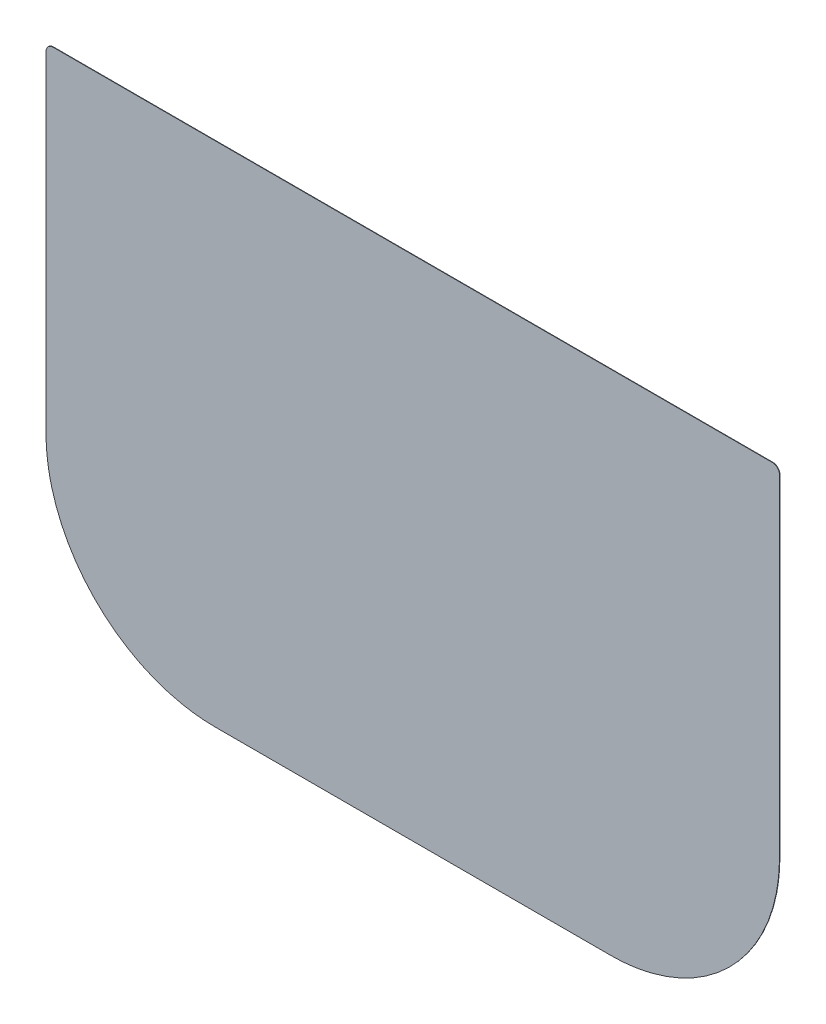
ISO-10303-21;
HEADER;
FILE_DESCRIPTION(('STEP AP214'),'2;1');
FILE_NAME('part.step','',(''),(''),'','','');
FILE_SCHEMA(('AUTOMOTIVE_DESIGN { 1 0 10303 214 1 1 1 1 }'));
ENDSEC;
DATA;
#1=APPLICATION_CONTEXT('core data for automotive mechanical design processes');
#2=APPLICATION_PROTOCOL_DEFINITION('international standard','automotive_design',2000,#1);
#3=PRODUCT_CONTEXT('',#1,'mechanical');
#4=PRODUCT('Part','Part','',(#3));
#5=PRODUCT_RELATED_PRODUCT_CATEGORY('part','',(#4));
#6=PRODUCT_DEFINITION_FORMATION('','',#4);
#7=PRODUCT_DEFINITION_CONTEXT('part definition',#1,'design');
#8=PRODUCT_DEFINITION('design','',#6,#7);
#9=PRODUCT_DEFINITION_SHAPE('','',#8);
#10=(LENGTH_UNIT() NAMED_UNIT(*) SI_UNIT(.MILLI.,.METRE.));
#11=(NAMED_UNIT(*) PLANE_ANGLE_UNIT() SI_UNIT($,.RADIAN.));
#12=(NAMED_UNIT(*) SI_UNIT($,.STERADIAN.) SOLID_ANGLE_UNIT());
#13=UNCERTAINTY_MEASURE_WITH_UNIT(LENGTH_MEASURE(1.E-05),#10,'distance_accuracy_value','');
#14=(GEOMETRIC_REPRESENTATION_CONTEXT(3) GLOBAL_UNCERTAINTY_ASSIGNED_CONTEXT((#13)) GLOBAL_UNIT_ASSIGNED_CONTEXT((#10,
#11,#12)) REPRESENTATION_CONTEXT('',''));
#15=CARTESIAN_POINT('',(0.,0.,0.));
#16=DIRECTION('',(0.,0.,1.));
#17=DIRECTION('',(1.,0.,0.));
#18=AXIS2_PLACEMENT_3D('',#15,#16,#17);
#19=CARTESIAN_POINT('',(133.695098624677,104.963199661161,0.2));
#20=DIRECTION('',(0.,0.,-1.));
#21=DIRECTION('',(-1.,0.,0.));
#22=AXIS2_PLACEMENT_3D('',#19,#20,#21);
#23=CYLINDRICAL_SURFACE('',#22,75.7951241974776);
#24=CARTESIAN_POINT('',(133.695098624677,104.963199661161,0.));
#25=DIRECTION('',(0.,0.,1.));
#26=DIRECTION('',(1.,0.,0.));
#27=AXIS2_PLACEMENT_3D('',#24,#25,#26);
#28=CIRCLE('',#27,75.7951241974776);
#29=CARTESIAN_POINT('',(94.6448692825477,40.0018231329636,0.));
#30=VERTEX_POINT('',#29);
#31=CARTESIAN_POINT('',(118.987614900912,30.6087056838208,0.));
#32=VERTEX_POINT('',#31);
#33=EDGE_CURVE('E189',#30,#32,#28,.T.);
#34=ORIENTED_EDGE('',*,*,#33,.T.);
#35=DIRECTION('',(0.,0.,-1.));
#36=VECTOR('',#35,1.);
#37=CARTESIAN_POINT('',(118.987614900912,30.6087056838208,0.2));
#38=LINE('',#37,#36);
#39=CARTESIAN_POINT('',(118.987614900912,30.6087056838208,0.2));
#40=VERTEX_POINT('',#39);
#41=EDGE_CURVE('E11',#40,#32,#38,.T.);
#42=ORIENTED_EDGE('',*,*,#41,.F.);
#43=CARTESIAN_POINT('',(133.695098624677,104.963199661161,0.2));
#44=DIRECTION('',(0.,0.,1.));
#45=DIRECTION('',(1.,0.,0.));
#46=AXIS2_PLACEMENT_3D('',#43,#44,#45);
#47=CIRCLE('',#46,75.7951241974776);
#48=CARTESIAN_POINT('',(94.6448692825477,40.0018231329636,0.2));
#49=VERTEX_POINT('',#48);
#50=EDGE_CURVE('E223',#49,#40,#47,.T.);
#51=ORIENTED_EDGE('',*,*,#50,.F.);
#52=DIRECTION('',(0.,0.,-1.));
#53=VECTOR('',#52,1.);
#54=CARTESIAN_POINT('',(94.6448692825477,40.0018231329636,0.2));
#55=LINE('',#54,#53);
#56=EDGE_CURVE('E185',#49,#30,#55,.T.);
#57=ORIENTED_EDGE('',*,*,#56,.T.);
#58=EDGE_LOOP('',(#34,#42,#51,#57));
#59=FACE_BOUND('',#58,.T.);
#60=ADVANCED_FACE('F33',(#59),#23,.T.);
#61=CARTESIAN_POINT('',(133.844639792639,105.889225961732,0.2));
#62=DIRECTION('',(0.,0.,-1.));
#63=DIRECTION('',(-1.,0.,0.));
#64=AXIS2_PLACEMENT_3D('',#61,#62,#63);
#65=CYLINDRICAL_SURFACE('',#64,76.7325740604757);
#66=CARTESIAN_POINT('',(133.844639792639,105.889225961732,0.));
#67=DIRECTION('',(0.,0.,1.));
#68=DIRECTION('',(1.,0.,0.));
#69=AXIS2_PLACEMENT_3D('',#66,#67,#68);
#70=CIRCLE('',#69,76.7325740604757);
#71=CARTESIAN_POINT('',(133.877646,29.156659,0.));
#72=VERTEX_POINT('',#71);
#73=EDGE_CURVE('E192',#32,#72,#70,.T.);
#74=ORIENTED_EDGE('',*,*,#73,.T.);
#75=DIRECTION('',(0.,0.,-1.));
#76=VECTOR('',#75,1.);
#77=CARTESIAN_POINT('',(133.877646,29.156659,0.2));
#78=LINE('',#77,#76);
#79=CARTESIAN_POINT('',(133.877646,29.156659,0.2));
#80=VERTEX_POINT('',#79);
#81=EDGE_CURVE('E41',#80,#72,#78,.T.);
#82=ORIENTED_EDGE('',*,*,#81,.F.);
#83=CARTESIAN_POINT('',(133.844639792639,105.889225961732,0.2));
#84=DIRECTION('',(0.,0.,1.));
#85=DIRECTION('',(1.,0.,0.));
#86=AXIS2_PLACEMENT_3D('',#83,#84,#85);
#87=CIRCLE('',#86,76.7325740604757);
#88=EDGE_CURVE('E122',#40,#80,#87,.T.);
#89=ORIENTED_EDGE('',*,*,#88,.F.);
#90=ORIENTED_EDGE('',*,*,#41,.T.);
#91=EDGE_LOOP('',(#74,#82,#89,#90));
#92=FACE_BOUND('',#91,.T.);
#93=ADVANCED_FACE('F331',(#92),#65,.T.);
#94=CARTESIAN_POINT('',(311.4628,29.156659,0.2));
#95=DIRECTION('',(0.,1.,0.));
#96=DIRECTION('',(0.,0.,1.));
#97=AXIS2_PLACEMENT_3D('',#94,#95,#96);
#98=PLANE('',#97);
#99=DIRECTION('',(1.,0.,0.));
#100=VECTOR('',#99,1.);
#101=CARTESIAN_POINT('',(311.4628,29.156659,0.));
#102=LINE('',#101,#100);
#103=CARTESIAN_POINT('',(311.4628,29.156659,0.));
#104=VERTEX_POINT('',#103);
#105=EDGE_CURVE('E194',#72,#104,#102,.T.);
#106=ORIENTED_EDGE('',*,*,#105,.T.);
#107=DIRECTION('',(0.,0.,-1.));
#108=VECTOR('',#107,1.);
#109=CARTESIAN_POINT('',(311.4628,29.156659,0.2));
#110=LINE('',#109,#108);
#111=CARTESIAN_POINT('',(311.4628,29.156659,0.2));
#112=VERTEX_POINT('',#111);
#113=EDGE_CURVE('E260',#112,#104,#110,.T.);
#114=ORIENTED_EDGE('',*,*,#113,.F.);
#115=DIRECTION('',(1.,0.,0.));
#116=VECTOR('',#115,1.);
#117=CARTESIAN_POINT('',(311.4628,29.156659,0.2));
#118=LINE('',#117,#116);
#119=EDGE_CURVE('E268',#80,#112,#118,.T.);
#120=ORIENTED_EDGE('',*,*,#119,.F.);
#121=ORIENTED_EDGE('',*,*,#81,.T.);
#122=EDGE_LOOP('',(#106,#114,#120,#121));
#123=FACE_BOUND('',#122,.T.);
#124=ADVANCED_FACE('F266',(#123),#98,.F.);
#125=CARTESIAN_POINT('',(311.459388599687,106.548561020619,0.2));
#126=DIRECTION('',(0.,0.,-1.));
#127=DIRECTION('',(-1.,0.,0.));
#128=AXIS2_PLACEMENT_3D('',#125,#126,#127);
#129=CYLINDRICAL_SURFACE('',#128,77.3919020958055);
#130=CARTESIAN_POINT('',(311.459388599687,106.548561020619,0.));
#131=DIRECTION('',(0.,0.,1.));
#132=DIRECTION('',(1.,0.,0.));
#133=AXIS2_PLACEMENT_3D('',#130,#131,#132);
#134=CIRCLE('',#133,77.3919020958055);
#135=CARTESIAN_POINT('',(321.271270405472,29.7811624360893,0.));
#136=VERTEX_POINT('',#135);
#137=EDGE_CURVE('E196',#104,#136,#134,.T.);
#138=ORIENTED_EDGE('',*,*,#137,.T.);
#139=DIRECTION('',(0.,0.,-1.));
#140=VECTOR('',#139,1.);
#141=CARTESIAN_POINT('',(321.271270405472,29.7811624360893,0.2));
#142=LINE('',#141,#140);
#143=CARTESIAN_POINT('',(321.271270405472,29.7811624360893,0.2));
#144=VERTEX_POINT('',#143);
#145=EDGE_CURVE('E257',#144,#136,#142,.T.);
#146=ORIENTED_EDGE('',*,*,#145,.F.);
#147=CARTESIAN_POINT('',(311.459388599687,106.548561020619,0.2));
#148=DIRECTION('',(0.,0.,1.));
#149=DIRECTION('',(1.,0.,0.));
#150=AXIS2_PLACEMENT_3D('',#147,#148,#149);
#151=CIRCLE('',#150,77.3919020958055);
#152=EDGE_CURVE('E286',#112,#144,#151,.T.);
#153=ORIENTED_EDGE('',*,*,#152,.F.);
#154=ORIENTED_EDGE('',*,*,#113,.T.);
#155=EDGE_LOOP('',(#138,#146,#153,#154));
#156=FACE_BOUND('',#155,.T.);
#157=ADVANCED_FACE('F277',(#156),#129,.T.);
#158=CARTESIAN_POINT('',(311.583107655466,105.268593305292,0.2));
#159=DIRECTION('',(0.,0.,-1.));
#160=DIRECTION('',(-1.,0.,0.));
#161=AXIS2_PLACEMENT_3D('',#158,#159,#160);
#162=CYLINDRICAL_SURFACE('',#161,76.1065878666445);
#163=CARTESIAN_POINT('',(311.583107655466,105.268593305292,0.));
#164=DIRECTION('',(0.,0.,1.));
#165=DIRECTION('',(1.,0.,0.));
#166=AXIS2_PLACEMENT_3D('',#163,#164,#165);
#167=CIRCLE('',#166,76.1065878666445);
#168=CARTESIAN_POINT('',(330.918478464512,31.6591091855133,0.));
#169=VERTEX_POINT('',#168);
#170=EDGE_CURVE('E198',#136,#169,#167,.T.);
#171=ORIENTED_EDGE('',*,*,#170,.T.);
#172=DIRECTION('',(0.,0.,-1.));
#173=VECTOR('',#172,1.);
#174=CARTESIAN_POINT('',(330.918478464512,31.6591091855133,0.2));
#175=LINE('',#174,#173);
#176=CARTESIAN_POINT('',(330.918478464512,31.6591091855133,0.2));
#177=VERTEX_POINT('',#176);
#178=EDGE_CURVE('E254',#177,#169,#175,.T.);
#179=ORIENTED_EDGE('',*,*,#178,.F.);
#180=CARTESIAN_POINT('',(311.583107655466,105.268593305292,0.2));
#181=DIRECTION('',(0.,0.,1.));
#182=DIRECTION('',(1.,0.,0.));
#183=AXIS2_PLACEMENT_3D('',#180,#181,#182);
#184=CIRCLE('',#183,76.1065878666445);
#185=EDGE_CURVE('E283',#144,#177,#184,.T.);
#186=ORIENTED_EDGE('',*,*,#185,.F.);
#187=ORIENTED_EDGE('',*,*,#145,.T.);
#188=EDGE_LOOP('',(#171,#179,#186,#187));
#189=FACE_BOUND('',#188,.T.);
#190=ADVANCED_FACE('F281',(#189),#162,.T.);
#191=CARTESIAN_POINT('',(311.601534025898,105.070604814568,0.2));
#192=DIRECTION('',(0.,0.,-1.));
#193=DIRECTION('',(-1.,0.,0.));
#194=AXIS2_PLACEMENT_3D('',#191,#192,#193);
#195=CYLINDRICAL_SURFACE('',#194,75.9104211089572);
#196=CARTESIAN_POINT('',(311.601534025898,105.070604814568,0.));
#197=DIRECTION('',(0.,0.,1.));
#198=DIRECTION('',(1.,0.,0.));
#199=AXIS2_PLACEMENT_3D('',#196,#197,#198);
#200=CIRCLE('',#199,75.9104211089572);
#201=CARTESIAN_POINT('',(349.084681403762,39.0599564645589,0.));
#202=VERTEX_POINT('',#201);
#203=EDGE_CURVE('E200',#169,#202,#200,.T.);
#204=ORIENTED_EDGE('',*,*,#203,.T.);
#205=DIRECTION('',(0.,0.,-1.));
#206=VECTOR('',#205,1.);
#207=CARTESIAN_POINT('',(349.084681403762,39.0599564645589,0.2));
#208=LINE('',#207,#206);
#209=CARTESIAN_POINT('',(349.084681403762,39.0599564645589,0.2));
#210=VERTEX_POINT('',#209);
#211=EDGE_CURVE('E251',#210,#202,#208,.T.);
#212=ORIENTED_EDGE('',*,*,#211,.F.);
#213=CARTESIAN_POINT('',(311.601534025898,105.070604814568,0.2));
#214=DIRECTION('',(0.,0.,1.));
#215=DIRECTION('',(1.,0.,0.));
#216=AXIS2_PLACEMENT_3D('',#213,#214,#215);
#217=CIRCLE('',#216,75.9104211089572);
#218=EDGE_CURVE('E285',#177,#210,#217,.T.);
#219=ORIENTED_EDGE('',*,*,#218,.F.);
#220=ORIENTED_EDGE('',*,*,#178,.T.);
#221=EDGE_LOOP('',(#204,#212,#219,#220));
#222=FACE_BOUND('',#221,.T.);
#223=ADVANCED_FACE('F344',(#222),#195,.T.);
#224=CARTESIAN_POINT('',(311.197949292105,105.733515100332,0.2));
#225=DIRECTION('',(0.,0.,-1.));
#226=DIRECTION('',(-1.,0.,0.));
#227=AXIS2_PLACEMENT_3D('',#224,#225,#226);
#228=CYLINDRICAL_SURFACE('',#227,76.6861649273088);
#229=CARTESIAN_POINT('',(311.197949292105,105.733515100332,0.));
#230=DIRECTION('',(0.,0.,1.));
#231=DIRECTION('',(1.,0.,0.));
#232=AXIS2_PLACEMENT_3D('',#229,#230,#231);
#233=CIRCLE('',#232,76.6861649273088);
#234=CARTESIAN_POINT('',(376.927164050907,66.2311326601597,0.));
#235=VERTEX_POINT('',#234);
#236=EDGE_CURVE('E202',#202,#235,#233,.T.);
#237=ORIENTED_EDGE('',*,*,#236,.T.);
#238=DIRECTION('',(0.,0.,-1.));
#239=VECTOR('',#238,1.);
#240=CARTESIAN_POINT('',(376.927164050907,66.2311326601597,0.2));
#241=LINE('',#240,#239);
#242=CARTESIAN_POINT('',(376.927164050907,66.2311326601597,0.2));
#243=VERTEX_POINT('',#242);
#244=EDGE_CURVE('E248',#243,#235,#241,.T.);
#245=ORIENTED_EDGE('',*,*,#244,.F.);
#246=CARTESIAN_POINT('',(311.197949292105,105.733515100332,0.2));
#247=DIRECTION('',(0.,0.,1.));
#248=DIRECTION('',(1.,0.,0.));
#249=AXIS2_PLACEMENT_3D('',#246,#247,#248);
#250=CIRCLE('',#249,76.6861649273088);
#251=EDGE_CURVE('E288',#210,#243,#250,.T.);
#252=ORIENTED_EDGE('',*,*,#251,.F.);
#253=ORIENTED_EDGE('',*,*,#211,.T.);
#254=EDGE_LOOP('',(#237,#245,#252,#253));
#255=FACE_BOUND('',#254,.T.);
#256=ADVANCED_FACE('F347',(#255),#228,.T.);
#257=CARTESIAN_POINT('',(311.958025934466,105.285521775636,0.2));
#258=DIRECTION('',(0.,0.,-1.));
#259=DIRECTION('',(-1.,0.,0.));
#260=AXIS2_PLACEMENT_3D('',#257,#258,#259);
#261=CYLINDRICAL_SURFACE('',#260,75.8039195343896);
#262=CARTESIAN_POINT('',(311.958025934466,105.285521775636,0.));
#263=DIRECTION('',(0.,0.,1.));
#264=DIRECTION('',(1.,0.,0.));
#265=AXIS2_PLACEMENT_3D('',#262,#263,#264);
#266=CIRCLE('',#265,75.8039195343896);
#267=CARTESIAN_POINT('',(386.321060070131,90.5758864669635,0.));
#268=VERTEX_POINT('',#267);
#269=EDGE_CURVE('E204',#235,#268,#266,.T.);
#270=ORIENTED_EDGE('',*,*,#269,.T.);
#271=DIRECTION('',(0.,0.,-1.));
#272=VECTOR('',#271,1.);
#273=CARTESIAN_POINT('',(386.321060070131,90.5758864669635,0.2));
#274=LINE('',#273,#272);
#275=CARTESIAN_POINT('',(386.321060070131,90.5758864669635,0.2));
#276=VERTEX_POINT('',#275);
#277=EDGE_CURVE('E245',#276,#268,#274,.T.);
#278=ORIENTED_EDGE('',*,*,#277,.F.);
#279=CARTESIAN_POINT('',(311.958025934466,105.285521775636,0.2));
#280=DIRECTION('',(0.,0.,1.));
#281=DIRECTION('',(1.,0.,0.));
#282=AXIS2_PLACEMENT_3D('',#279,#280,#281);
#283=CIRCLE('',#282,75.8039195343896);
#284=EDGE_CURVE('E294',#243,#276,#283,.T.);
#285=ORIENTED_EDGE('',*,*,#284,.F.);
#286=ORIENTED_EDGE('',*,*,#244,.T.);
#287=EDGE_LOOP('',(#270,#278,#285,#286));
#288=FACE_BOUND('',#287,.T.);
#289=ADVANCED_FACE('F351',(#288),#261,.T.);
#290=CARTESIAN_POINT('',(311.02538414561,105.43496515916,0.2));
#291=DIRECTION('',(0.,0.,-1.));
#292=DIRECTION('',(-1.,0.,0.));
#293=AXIS2_PLACEMENT_3D('',#290,#291,#292);
#294=CYLINDRICAL_SURFACE('',#293,76.7478405723012);
#295=CARTESIAN_POINT('',(311.02538414561,105.43496515916,0.));
#296=DIRECTION('',(0.,0.,1.));
#297=DIRECTION('',(1.,0.,0.));
#298=AXIS2_PLACEMENT_3D('',#295,#296,#297);
#299=CIRCLE('',#298,76.7478405723012);
#300=CARTESIAN_POINT('',(387.773218,105.467077,0.));
#301=VERTEX_POINT('',#300);
#302=EDGE_CURVE('E206',#268,#301,#299,.T.);
#303=ORIENTED_EDGE('',*,*,#302,.T.);
#304=DIRECTION('',(0.,0.,-1.));
#305=VECTOR('',#304,1.);
#306=CARTESIAN_POINT('',(387.773218,105.467077,0.2));
#307=LINE('',#306,#305);
#308=CARTESIAN_POINT('',(387.773218,105.467077,0.2));
#309=VERTEX_POINT('',#308);
#310=EDGE_CURVE('E242',#309,#301,#307,.T.);
#311=ORIENTED_EDGE('',*,*,#310,.F.);
#312=CARTESIAN_POINT('',(311.02538414561,105.43496515916,0.2));
#313=DIRECTION('',(0.,0.,1.));
#314=DIRECTION('',(1.,0.,0.));
#315=AXIS2_PLACEMENT_3D('',#312,#313,#314);
#316=CIRCLE('',#315,76.7478405723012);
#317=EDGE_CURVE('E296',#276,#309,#316,.T.);
#318=ORIENTED_EDGE('',*,*,#317,.F.);
#319=ORIENTED_EDGE('',*,*,#277,.T.);
#320=EDGE_LOOP('',(#303,#311,#318,#319));
#321=FACE_BOUND('',#320,.T.);
#322=ADVANCED_FACE('F355',(#321),#294,.T.);
#323=CARTESIAN_POINT('',(387.773218,254.57742,0.2));
#324=DIRECTION('',(-1.,0.,0.));
#325=DIRECTION('',(0.,0.,1.));
#326=AXIS2_PLACEMENT_3D('',#323,#324,#325);
#327=PLANE('',#326);
#328=DIRECTION('',(0.,1.,0.));
#329=VECTOR('',#328,1.);
#330=CARTESIAN_POINT('',(387.773218,254.57742,0.));
#331=LINE('',#330,#329);
#332=CARTESIAN_POINT('',(387.773218,254.57742,0.));
#333=VERTEX_POINT('',#332);
#334=EDGE_CURVE('E208',#301,#333,#331,.T.);
#335=ORIENTED_EDGE('',*,*,#334,.T.);
#336=DIRECTION('',(0.,0.,-1.));
#337=VECTOR('',#336,1.);
#338=CARTESIAN_POINT('',(387.773218,254.57742,0.2));
#339=LINE('',#338,#337);
#340=CARTESIAN_POINT('',(387.773218,254.57742,0.2));
#341=VERTEX_POINT('',#340);
#342=EDGE_CURVE('E239',#341,#333,#339,.T.);
#343=ORIENTED_EDGE('',*,*,#342,.F.);
#344=DIRECTION('',(0.,1.,0.));
#345=VECTOR('',#344,1.);
#346=CARTESIAN_POINT('',(387.773218,254.57742,0.2));
#347=LINE('',#346,#345);
#348=EDGE_CURVE('E298',#309,#341,#347,.T.);
#349=ORIENTED_EDGE('',*,*,#348,.F.);
#350=ORIENTED_EDGE('',*,*,#310,.T.);
#351=EDGE_LOOP('',(#335,#343,#349,#350));
#352=FACE_BOUND('',#351,.T.);
#353=ADVANCED_FACE('F359',(#352),#327,.F.);
#354=CARTESIAN_POINT('',(384.594012216893,254.577448216884,0.2));
#355=DIRECTION('',(0.,0.,-1.));
#356=DIRECTION('',(-1.,0.,0.));
#357=AXIS2_PLACEMENT_3D('',#354,#355,#356);
#358=CYLINDRICAL_SURFACE('',#357,3.17920578323273);
#359=CARTESIAN_POINT('',(384.594012216893,254.577448216884,0.));
#360=DIRECTION('',(0.,0.,1.));
#361=DIRECTION('',(1.,0.,0.));
#362=AXIS2_PLACEMENT_3D('',#359,#360,#361);
#363=CIRCLE('',#362,3.17920578323273);
#364=CARTESIAN_POINT('',(384.593985,257.756654,0.));
#365=VERTEX_POINT('',#364);
#366=EDGE_CURVE('E210',#333,#365,#363,.T.);
#367=ORIENTED_EDGE('',*,*,#366,.T.);
#368=DIRECTION('',(0.,0.,-1.));
#369=VECTOR('',#368,1.);
#370=CARTESIAN_POINT('',(384.593985,257.756654,0.2));
#371=LINE('',#370,#369);
#372=CARTESIAN_POINT('',(384.593985,257.756654,0.2));
#373=VERTEX_POINT('',#372);
#374=EDGE_CURVE('E236',#373,#365,#371,.T.);
#375=ORIENTED_EDGE('',*,*,#374,.F.);
#376=CARTESIAN_POINT('',(384.594012216893,254.577448216884,0.2));
#377=DIRECTION('',(0.,0.,1.));
#378=DIRECTION('',(1.,0.,0.));
#379=AXIS2_PLACEMENT_3D('',#376,#377,#378);
#380=CIRCLE('',#379,3.17920578323273);
#381=EDGE_CURVE('E300',#341,#373,#380,.T.);
#382=ORIENTED_EDGE('',*,*,#381,.F.);
#383=ORIENTED_EDGE('',*,*,#342,.T.);
#384=EDGE_LOOP('',(#367,#375,#382,#383));
#385=FACE_BOUND('',#384,.T.);
#386=ADVANCED_FACE('F363',(#385),#358,.T.);
#387=CARTESIAN_POINT('',(60.752459,257.756654,0.2));
#388=DIRECTION('',(0.,-1.,0.));
#389=DIRECTION('',(0.,0.,-1.));
#390=AXIS2_PLACEMENT_3D('',#387,#388,#389);
#391=PLANE('',#390);
#392=DIRECTION('',(-1.,0.,0.));
#393=VECTOR('',#392,1.);
#394=CARTESIAN_POINT('',(60.752459,257.756654,0.));
#395=LINE('',#394,#393);
#396=CARTESIAN_POINT('',(60.752459,257.756654,0.));
#397=VERTEX_POINT('',#396);
#398=EDGE_CURVE('E212',#365,#397,#395,.T.);
#399=ORIENTED_EDGE('',*,*,#398,.T.);
#400=DIRECTION('',(0.,0.,-1.));
#401=VECTOR('',#400,1.);
#402=CARTESIAN_POINT('',(60.752459,257.756654,0.2));
#403=LINE('',#402,#401);
#404=CARTESIAN_POINT('',(60.752459,257.756654,0.2));
#405=VERTEX_POINT('',#404);
#406=EDGE_CURVE('E233',#405,#397,#403,.T.);
#407=ORIENTED_EDGE('',*,*,#406,.F.);
#408=DIRECTION('',(-1.,0.,0.));
#409=VECTOR('',#408,1.);
#410=CARTESIAN_POINT('',(60.752459,257.756654,0.2));
#411=LINE('',#410,#409);
#412=EDGE_CURVE('E302',#373,#405,#411,.T.);
#413=ORIENTED_EDGE('',*,*,#412,.F.);
#414=ORIENTED_EDGE('',*,*,#374,.T.);
#415=EDGE_LOOP('',(#399,#407,#413,#414));
#416=FACE_BOUND('',#415,.T.);
#417=ADVANCED_FACE('F367',(#416),#391,.F.);
#418=CARTESIAN_POINT('',(60.7522073004468,254.577672699474,0.2));
#419=DIRECTION('',(0.,0.,-1.));
#420=DIRECTION('',(-1.,0.,0.));
#421=AXIS2_PLACEMENT_3D('',#418,#419,#420);
#422=CYLINDRICAL_SURFACE('',#421,3.17898131049042);
#423=CARTESIAN_POINT('',(60.7522073004468,254.577672699474,0.));
#424=DIRECTION('',(0.,0.,1.));
#425=DIRECTION('',(1.,0.,0.));
#426=AXIS2_PLACEMENT_3D('',#423,#424,#425);
#427=CIRCLE('',#426,3.17898131049042);
#428=CARTESIAN_POINT('',(57.573226,254.57742,0.));
#429=VERTEX_POINT('',#428);
#430=EDGE_CURVE('E214',#397,#429,#427,.T.);
#431=ORIENTED_EDGE('',*,*,#430,.T.);
#432=DIRECTION('',(0.,0.,-1.));
#433=VECTOR('',#432,1.);
#434=CARTESIAN_POINT('',(57.573226,254.57742,0.2));
#435=LINE('',#434,#433);
#436=CARTESIAN_POINT('',(57.573226,254.57742,0.2));
#437=VERTEX_POINT('',#436);
#438=EDGE_CURVE('E230',#437,#429,#435,.T.);
#439=ORIENTED_EDGE('',*,*,#438,.F.);
#440=CARTESIAN_POINT('',(60.7522073004468,254.577672699474,0.2));
#441=DIRECTION('',(0.,0.,1.));
#442=DIRECTION('',(1.,0.,0.));
#443=AXIS2_PLACEMENT_3D('',#440,#441,#442);
#444=CIRCLE('',#443,3.17898131049042);
#445=EDGE_CURVE('E304',#405,#437,#444,.T.);
#446=ORIENTED_EDGE('',*,*,#445,.F.);
#447=ORIENTED_EDGE('',*,*,#406,.T.);
#448=EDGE_LOOP('',(#431,#439,#446,#447));
#449=FACE_BOUND('',#448,.T.);
#450=ADVANCED_FACE('F371',(#449),#422,.T.);
#451=CARTESIAN_POINT('',(57.573226,105.46108,0.2));
#452=DIRECTION('',(1.,0.,0.));
#453=DIRECTION('',(0.,0.,-1.));
#454=AXIS2_PLACEMENT_3D('',#451,#452,#453);
#455=PLANE('',#454);
#456=DIRECTION('',(0.,-1.,0.));
#457=VECTOR('',#456,1.);
#458=CARTESIAN_POINT('',(57.573226,105.46108,0.));
#459=LINE('',#458,#457);
#460=CARTESIAN_POINT('',(57.573226,105.46108,0.));
#461=VERTEX_POINT('',#460);
#462=EDGE_CURVE('E216',#429,#461,#459,.T.);
#463=ORIENTED_EDGE('',*,*,#462,.T.);
#464=DIRECTION('',(0.,0.,-1.));
#465=VECTOR('',#464,1.);
#466=CARTESIAN_POINT('',(57.573226,105.46108,0.2));
#467=LINE('',#466,#465);
#468=CARTESIAN_POINT('',(57.573226,105.46108,0.2));
#469=VERTEX_POINT('',#468);
#470=EDGE_CURVE('E227',#469,#461,#467,.T.);
#471=ORIENTED_EDGE('',*,*,#470,.F.);
#472=DIRECTION('',(0.,-1.,0.));
#473=VECTOR('',#472,1.);
#474=CARTESIAN_POINT('',(57.573226,105.46108,0.2));
#475=LINE('',#474,#473);
#476=EDGE_CURVE('E306',#437,#469,#475,.T.);
#477=ORIENTED_EDGE('',*,*,#476,.F.);
#478=ORIENTED_EDGE('',*,*,#438,.T.);
#479=EDGE_LOOP('',(#463,#471,#477,#478));
#480=FACE_BOUND('',#479,.T.);
#481=ADVANCED_FACE('F312',(#480),#455,.F.);
#482=CARTESIAN_POINT('',(134.932890852501,105.462850704118,0.2));
#483=DIRECTION('',(0.,0.,-1.));
#484=DIRECTION('',(-1.,0.,0.));
#485=AXIS2_PLACEMENT_3D('',#482,#483,#484);
#486=CYLINDRICAL_SURFACE('',#485,77.3596648727657);
#487=CARTESIAN_POINT('',(134.932890852501,105.462850704118,0.));
#488=DIRECTION('',(0.,0.,1.));
#489=DIRECTION('',(1.,0.,0.));
#490=AXIS2_PLACEMENT_3D('',#487,#488,#489);
#491=CIRCLE('',#490,77.3596648727657);
#492=CARTESIAN_POINT('',(58.1976806721113,95.6534028196499,0.));
#493=VERTEX_POINT('',#492);
#494=EDGE_CURVE('E218',#461,#493,#491,.T.);
#495=ORIENTED_EDGE('',*,*,#494,.T.);
#496=DIRECTION('',(0.,0.,-1.));
#497=VECTOR('',#496,1.);
#498=CARTESIAN_POINT('',(58.1976806721113,95.6534028196499,0.2));
#499=LINE('',#498,#497);
#500=CARTESIAN_POINT('',(58.1976806721113,95.6534028196499,0.2));
#501=VERTEX_POINT('',#500);
#502=EDGE_CURVE('E180',#501,#493,#499,.T.);
#503=ORIENTED_EDGE('',*,*,#502,.F.);
#504=CARTESIAN_POINT('',(134.932890852501,105.462850704118,0.2));
#505=DIRECTION('',(0.,0.,1.));
#506=DIRECTION('',(1.,0.,0.));
#507=AXIS2_PLACEMENT_3D('',#504,#505,#506);
#508=CIRCLE('',#507,77.3596648727657);
#509=EDGE_CURVE('E171',#469,#501,#508,.T.);
#510=ORIENTED_EDGE('',*,*,#509,.F.);
#511=ORIENTED_EDGE('',*,*,#470,.T.);
#512=EDGE_LOOP('',(#495,#503,#510,#511));
#513=FACE_BOUND('',#512,.T.);
#514=ADVANCED_FACE('F316',(#513),#486,.T.);
#515=CARTESIAN_POINT('',(133.657192773981,105.336555719698,0.2));
#516=DIRECTION('',(0.,0.,-1.));
#517=DIRECTION('',(-1.,0.,0.));
#518=AXIS2_PLACEMENT_3D('',#515,#516,#517);
#519=CYLINDRICAL_SURFACE('',#518,76.0782585022683);
#520=CARTESIAN_POINT('',(133.657192773981,105.336555719698,0.));
#521=DIRECTION('',(0.,0.,1.));
#522=DIRECTION('',(1.,0.,0.));
#523=AXIS2_PLACEMENT_3D('',#520,#521,#522);
#524=CIRCLE('',#523,76.0782585022683);
#525=CARTESIAN_POINT('',(60.0754813080101,86.0069630060237,0.));
#526=VERTEX_POINT('',#525);
#527=EDGE_CURVE('E179',#493,#526,#524,.T.);
#528=ORIENTED_EDGE('',*,*,#527,.T.);
#529=DIRECTION('',(0.,0.,-1.));
#530=VECTOR('',#529,1.);
#531=CARTESIAN_POINT('',(60.0754813080101,86.0069630060237,0.2));
#532=LINE('',#531,#530);
#533=CARTESIAN_POINT('',(60.0754813080101,86.0069630060237,0.2));
#534=VERTEX_POINT('',#533);
#535=EDGE_CURVE('E176',#534,#526,#532,.T.);
#536=ORIENTED_EDGE('',*,*,#535,.F.);
#537=CARTESIAN_POINT('',(133.657192773981,105.336555719698,0.2));
#538=DIRECTION('',(0.,0.,1.));
#539=DIRECTION('',(1.,0.,0.));
#540=AXIS2_PLACEMENT_3D('',#537,#538,#539);
#541=CIRCLE('',#540,76.0782585022683);
#542=EDGE_CURVE('E165',#501,#534,#541,.T.);
#543=ORIENTED_EDGE('',*,*,#542,.F.);
#544=ORIENTED_EDGE('',*,*,#502,.T.);
#545=EDGE_LOOP('',(#528,#536,#543,#544));
#546=FACE_BOUND('',#545,.T.);
#547=ADVANCED_FACE('F177',(#546),#519,.T.);
#548=CARTESIAN_POINT('',(133.473615724766,105.319313550515,0.2));
#549=DIRECTION('',(0.,0.,-1.));
#550=DIRECTION('',(-1.,0.,0.));
#551=AXIS2_PLACEMENT_3D('',#548,#549,#550);
#552=CYLINDRICAL_SURFACE('',#551,75.8963307374833);
#553=CARTESIAN_POINT('',(133.473615724766,105.319313550515,0.));
#554=DIRECTION('',(0.,0.,1.));
#555=DIRECTION('',(1.,0.,0.));
#556=AXIS2_PLACEMENT_3D('',#553,#554,#555);
#557=CIRCLE('',#556,75.8963307374833);
#558=CARTESIAN_POINT('',(67.4757567881211,67.8421787188315,0.));
#559=VERTEX_POINT('',#558);
#560=EDGE_CURVE('E108',#526,#559,#557,.T.);
#561=ORIENTED_EDGE('',*,*,#560,.T.);
#562=DIRECTION('',(0.,0.,-1.));
#563=VECTOR('',#562,1.);
#564=CARTESIAN_POINT('',(67.4757567881211,67.8421787188315,0.2));
#565=LINE('',#564,#563);
#566=CARTESIAN_POINT('',(67.4757567881211,67.8421787188315,0.2));
#567=VERTEX_POINT('',#566);
#568=EDGE_CURVE('E181',#567,#559,#565,.T.);
#569=ORIENTED_EDGE('',*,*,#568,.F.);
#570=CARTESIAN_POINT('',(133.473615724766,105.319313550515,0.2));
#571=DIRECTION('',(0.,0.,1.));
#572=DIRECTION('',(1.,0.,0.));
#573=AXIS2_PLACEMENT_3D('',#570,#571,#572);
#574=CIRCLE('',#573,75.8963307374833);
#575=EDGE_CURVE('E169',#534,#567,#574,.T.);
#576=ORIENTED_EDGE('',*,*,#575,.F.);
#577=ORIENTED_EDGE('',*,*,#535,.T.);
#578=EDGE_LOOP('',(#561,#569,#576,#577));
#579=FACE_BOUND('',#578,.T.);
#580=ADVANCED_FACE('F183',(#579),#552,.T.);
#581=CARTESIAN_POINT('',(134.142847766829,105.72469263941,0.2));
#582=DIRECTION('',(0.,0.,-1.));
#583=DIRECTION('',(-1.,0.,0.));
#584=AXIS2_PLACEMENT_3D('',#581,#582,#583);
#585=CYLINDRICAL_SURFACE('',#584,76.6784577342689);
#586=CARTESIAN_POINT('',(134.142847766829,105.72469263941,0.));
#587=DIRECTION('',(0.,0.,1.));
#588=DIRECTION('',(1.,0.,0.));
#589=AXIS2_PLACEMENT_3D('',#586,#587,#588);
#590=CIRCLE('',#589,76.6784577342689);
#591=EDGE_CURVE('E114',#559,#30,#590,.T.);
#592=ORIENTED_EDGE('',*,*,#591,.T.);
#593=ORIENTED_EDGE('',*,*,#56,.F.);
#594=CARTESIAN_POINT('',(134.142847766829,105.72469263941,0.2));
#595=DIRECTION('',(0.,0.,1.));
#596=DIRECTION('',(1.,0.,0.));
#597=AXIS2_PLACEMENT_3D('',#594,#595,#596);
#598=CIRCLE('',#597,76.6784577342689);
#599=EDGE_CURVE('E49',#567,#49,#598,.T.);
#600=ORIENTED_EDGE('',*,*,#599,.F.);
#601=ORIENTED_EDGE('',*,*,#568,.T.);
#602=EDGE_LOOP('',(#592,#593,#600,#601));
#603=FACE_BOUND('',#602,.T.);
#604=ADVANCED_FACE('F320',(#603),#585,.T.);
#605=CARTESIAN_POINT('',(133.695098624677,104.963199661161,0.2));
#606=DIRECTION('',(0.,0.,1.));
#607=DIRECTION('',(1.,0.,0.));
#608=AXIS2_PLACEMENT_3D('',#605,#606,#607);
#609=PLANE('',#608);
#610=ORIENTED_EDGE('',*,*,#50,.T.);
#611=ORIENTED_EDGE('',*,*,#88,.T.);
#612=ORIENTED_EDGE('',*,*,#119,.T.);
#613=ORIENTED_EDGE('',*,*,#152,.T.);
#614=ORIENTED_EDGE('',*,*,#185,.T.);
#615=ORIENTED_EDGE('',*,*,#218,.T.);
#616=ORIENTED_EDGE('',*,*,#251,.T.);
#617=ORIENTED_EDGE('',*,*,#284,.T.);
#618=ORIENTED_EDGE('',*,*,#317,.T.);
#619=ORIENTED_EDGE('',*,*,#348,.T.);
#620=ORIENTED_EDGE('',*,*,#381,.T.);
#621=ORIENTED_EDGE('',*,*,#412,.T.);
#622=ORIENTED_EDGE('',*,*,#445,.T.);
#623=ORIENTED_EDGE('',*,*,#476,.T.);
#624=ORIENTED_EDGE('',*,*,#509,.T.);
#625=ORIENTED_EDGE('',*,*,#542,.T.);
#626=ORIENTED_EDGE('',*,*,#575,.T.);
#627=ORIENTED_EDGE('',*,*,#599,.T.);
#628=EDGE_LOOP('',(#610,#611,#612,#613,#614,#615,#616,#617,#618,#619,#620,#621,#622,#623,#624,
#625,#626,#627));
#629=FACE_BOUND('',#628,.T.);
#630=ADVANCED_FACE('F167',(#629),#609,.T.);
#631=CARTESIAN_POINT('',(133.695098624677,104.963199661161,0.));
#632=DIRECTION('',(0.,0.,1.));
#633=DIRECTION('',(1.,0.,0.));
#634=AXIS2_PLACEMENT_3D('',#631,#632,#633);
#635=PLANE('',#634);
#636=ORIENTED_EDGE('',*,*,#33,.F.);
#637=ORIENTED_EDGE('',*,*,#591,.F.);
#638=ORIENTED_EDGE('',*,*,#560,.F.);
#639=ORIENTED_EDGE('',*,*,#527,.F.);
#640=ORIENTED_EDGE('',*,*,#494,.F.);
#641=ORIENTED_EDGE('',*,*,#462,.F.);
#642=ORIENTED_EDGE('',*,*,#430,.F.);
#643=ORIENTED_EDGE('',*,*,#398,.F.);
#644=ORIENTED_EDGE('',*,*,#366,.F.);
#645=ORIENTED_EDGE('',*,*,#334,.F.);
#646=ORIENTED_EDGE('',*,*,#302,.F.);
#647=ORIENTED_EDGE('',*,*,#269,.F.);
#648=ORIENTED_EDGE('',*,*,#236,.F.);
#649=ORIENTED_EDGE('',*,*,#203,.F.);
#650=ORIENTED_EDGE('',*,*,#170,.F.);
#651=ORIENTED_EDGE('',*,*,#137,.F.);
#652=ORIENTED_EDGE('',*,*,#105,.F.);
#653=ORIENTED_EDGE('',*,*,#73,.F.);
#654=EDGE_LOOP('',(#636,#637,#638,#639,#640,#641,#642,#643,#644,#645,#646,#647,#648,#649,#650,
#651,#652,#653));
#655=FACE_BOUND('',#654,.T.);
#656=ADVANCED_FACE('F272',(#655),#635,.F.);
#657=CLOSED_SHELL('',(#60,#93,#124,#157,#190,#223,#256,#289,#322,#353,#386,#417,#450,#481,#514,
#547,#580,#604,#630,#656));
#658=MANIFOLD_SOLID_BREP('B2',#657);
#659=ADVANCED_BREP_SHAPE_REPRESENTATION('',(#18,#658),#14);
#660=SHAPE_DEFINITION_REPRESENTATION(#9,#659);
ENDSEC;
END-ISO-10303-21;
